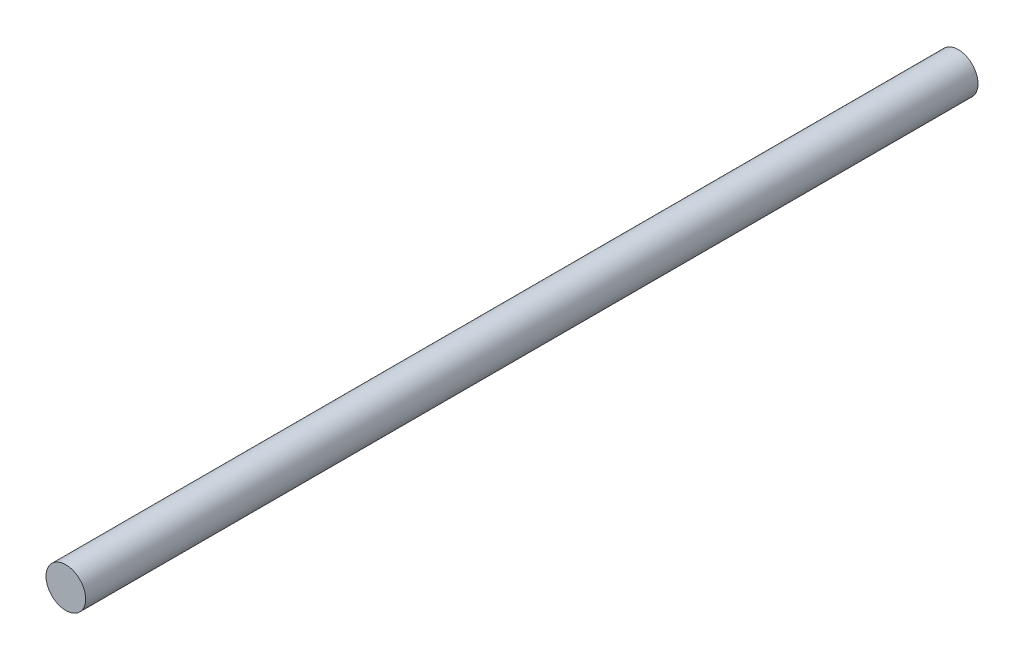
ISO-10303-21;
HEADER;
FILE_DESCRIPTION(('STEP AP214'),'2;1');
FILE_NAME('part.step','',(''),(''),'','','');
FILE_SCHEMA(('AUTOMOTIVE_DESIGN { 1 0 10303 214 1 1 1 1 }'));
ENDSEC;
DATA;
#1=APPLICATION_CONTEXT('core data for automotive mechanical design processes');
#2=APPLICATION_PROTOCOL_DEFINITION('international standard','automotive_design',2000,#1);
#3=PRODUCT_CONTEXT('',#1,'mechanical');
#4=PRODUCT('Part','Part','',(#3));
#5=PRODUCT_RELATED_PRODUCT_CATEGORY('part','',(#4));
#6=PRODUCT_DEFINITION_FORMATION('','',#4);
#7=PRODUCT_DEFINITION_CONTEXT('part definition',#1,'design');
#8=PRODUCT_DEFINITION('design','',#6,#7);
#9=PRODUCT_DEFINITION_SHAPE('','',#8);
#10=(LENGTH_UNIT() NAMED_UNIT(*) SI_UNIT(.MILLI.,.METRE.));
#11=(NAMED_UNIT(*) PLANE_ANGLE_UNIT() SI_UNIT($,.RADIAN.));
#12=(NAMED_UNIT(*) SI_UNIT($,.STERADIAN.) SOLID_ANGLE_UNIT());
#13=UNCERTAINTY_MEASURE_WITH_UNIT(LENGTH_MEASURE(1.E-05),#10,'distance_accuracy_value','');
#14=(GEOMETRIC_REPRESENTATION_CONTEXT(3) GLOBAL_UNCERTAINTY_ASSIGNED_CONTEXT((#13)) GLOBAL_UNIT_ASSIGNED_CONTEXT((#10,
#11,#12)) REPRESENTATION_CONTEXT('',''));
#15=CARTESIAN_POINT('',(0.,0.,0.));
#16=DIRECTION('',(0.,0.,1.));
#17=DIRECTION('',(1.,0.,0.));
#18=AXIS2_PLACEMENT_3D('',#15,#16,#17);
#19=CARTESIAN_POINT('',(-0.270441819863215,0.,90.));
#20=DIRECTION('',(0.,0.,-1.));
#21=DIRECTION('',(-1.,0.,0.));
#22=AXIS2_PLACEMENT_3D('',#19,#20,#21);
#23=CYLINDRICAL_SURFACE('',#22,2.);
#24=CARTESIAN_POINT('',(-0.270441819863215,0.,90.));
#25=DIRECTION('',(0.,0.,1.));
#26=DIRECTION('',(1.,0.,0.));
#27=AXIS2_PLACEMENT_3D('',#24,#25,#26);
#28=CIRCLE('',#27,2.);
#29=CARTESIAN_POINT('',(-2.27044181986322,0.,90.));
#30=VERTEX_POINT('',#29);
#31=EDGE_CURVE('E10',#30,#30,#28,.T.);
#32=CARTESIAN_POINT('',(-0.270441819863215,0.,0.));
#33=DIRECTION('',(0.,0.,1.));
#34=DIRECTION('',(1.,0.,0.));
#35=AXIS2_PLACEMENT_3D('',#32,#33,#34);
#36=CIRCLE('',#35,2.);
#37=CARTESIAN_POINT('',(-2.27044181986322,0.,0.));
#38=VERTEX_POINT('',#37);
#39=EDGE_CURVE('E39',#38,#38,#36,.T.);
#40=CARTESIAN_POINT('',(-2.27044181986322,0.,90.));
#41=CARTESIAN_POINT('',(-2.27044181986322,0.,89.0625));
#42=CARTESIAN_POINT('',(-2.27044181986322,0.,88.125));
#43=CARTESIAN_POINT('',(-2.27044181986322,0.,86.25));
#44=CARTESIAN_POINT('',(-2.27044181986322,0.,85.3125));
#45=CARTESIAN_POINT('',(-2.27044181986322,0.,83.4375));
#46=CARTESIAN_POINT('',(-2.27044181986322,0.,82.5));
#47=CARTESIAN_POINT('',(-2.27044181986322,0.,80.625));
#48=CARTESIAN_POINT('',(-2.27044181986322,0.,79.6875));
#49=CARTESIAN_POINT('',(-2.27044181986322,0.,77.8125));
#50=CARTESIAN_POINT('',(-2.27044181986322,0.,76.875));
#51=CARTESIAN_POINT('',(-2.27044181986322,0.,75.));
#52=CARTESIAN_POINT('',(-2.27044181986322,0.,74.0625));
#53=CARTESIAN_POINT('',(-2.27044181986322,0.,72.1875));
#54=CARTESIAN_POINT('',(-2.27044181986322,0.,71.25));
#55=CARTESIAN_POINT('',(-2.27044181986322,0.,69.375));
#56=CARTESIAN_POINT('',(-2.27044181986322,0.,68.4375));
#57=CARTESIAN_POINT('',(-2.27044181986322,0.,66.5625));
#58=CARTESIAN_POINT('',(-2.27044181986322,0.,65.625));
#59=CARTESIAN_POINT('',(-2.27044181986322,0.,63.75));
#60=CARTESIAN_POINT('',(-2.27044181986322,0.,62.8125));
#61=CARTESIAN_POINT('',(-2.27044181986322,0.,60.9375));
#62=CARTESIAN_POINT('',(-2.27044181986322,0.,60.));
#63=CARTESIAN_POINT('',(-2.27044181986322,0.,58.125));
#64=CARTESIAN_POINT('',(-2.27044181986322,0.,57.1875));
#65=CARTESIAN_POINT('',(-2.27044181986322,0.,55.3125));
#66=CARTESIAN_POINT('',(-2.27044181986322,0.,54.375));
#67=CARTESIAN_POINT('',(-2.27044181986322,0.,52.5));
#68=CARTESIAN_POINT('',(-2.27044181986322,0.,51.5625));
#69=CARTESIAN_POINT('',(-2.27044181986322,0.,49.6875));
#70=CARTESIAN_POINT('',(-2.27044181986322,0.,48.75));
#71=CARTESIAN_POINT('',(-2.27044181986322,0.,46.875));
#72=CARTESIAN_POINT('',(-2.27044181986322,0.,45.9375));
#73=CARTESIAN_POINT('',(-2.27044181986322,0.,44.0625));
#74=CARTESIAN_POINT('',(-2.27044181986322,0.,43.125));
#75=CARTESIAN_POINT('',(-2.27044181986322,0.,41.25));
#76=CARTESIAN_POINT('',(-2.27044181986322,0.,40.3125));
#77=CARTESIAN_POINT('',(-2.27044181986322,0.,38.4375));
#78=CARTESIAN_POINT('',(-2.27044181986322,0.,37.5));
#79=CARTESIAN_POINT('',(-2.27044181986322,0.,35.625));
#80=CARTESIAN_POINT('',(-2.27044181986322,0.,34.6875));
#81=CARTESIAN_POINT('',(-2.27044181986322,0.,32.8125));
#82=CARTESIAN_POINT('',(-2.27044181986322,0.,31.875));
#83=CARTESIAN_POINT('',(-2.27044181986322,0.,30.));
#84=CARTESIAN_POINT('',(-2.27044181986322,0.,29.0625));
#85=CARTESIAN_POINT('',(-2.27044181986322,0.,27.1875));
#86=CARTESIAN_POINT('',(-2.27044181986322,0.,26.25));
#87=CARTESIAN_POINT('',(-2.27044181986322,0.,24.375));
#88=CARTESIAN_POINT('',(-2.27044181986322,0.,23.4375));
#89=CARTESIAN_POINT('',(-2.27044181986322,0.,21.5625));
#90=CARTESIAN_POINT('',(-2.27044181986322,0.,20.625));
#91=CARTESIAN_POINT('',(-2.27044181986322,0.,18.75));
#92=CARTESIAN_POINT('',(-2.27044181986322,0.,17.8125));
#93=CARTESIAN_POINT('',(-2.27044181986322,0.,15.9375));
#94=CARTESIAN_POINT('',(-2.27044181986322,0.,15.));
#95=CARTESIAN_POINT('',(-2.27044181986322,0.,13.125));
#96=CARTESIAN_POINT('',(-2.27044181986322,0.,12.1875));
#97=CARTESIAN_POINT('',(-2.27044181986322,0.,10.3125));
#98=CARTESIAN_POINT('',(-2.27044181986322,0.,9.37499999999999));
#99=CARTESIAN_POINT('',(-2.27044181986322,0.,7.49999999999999));
#100=CARTESIAN_POINT('',(-2.27044181986322,0.,6.56249999999999));
#101=CARTESIAN_POINT('',(-2.27044181986322,0.,4.68749999999999));
#102=CARTESIAN_POINT('',(-2.27044181986322,0.,3.74999999999998));
#103=CARTESIAN_POINT('',(-2.27044181986322,0.,1.87499999999998));
#104=CARTESIAN_POINT('',(-2.27044181986322,0.,0.937499999999986));
#105=CARTESIAN_POINT('',(-2.27044181986322,0.,0.));
#106=B_SPLINE_CURVE_WITH_KNOTS('',3,(#40,#41,#42,#43,#44,#45,#46,#47,#48,#49,#50,#51,#52,#53,
#54,#55,#56,#57,#58,#59,#60,#61,#62,#63,#64,#65,#66,#67,#68,#69,#70,#71,#72,#73,#74,#75,#76,#77,
#78,#79,#80,#81,#82,#83,#84,#85,#86,#87,#88,#89,#90,#91,#92,#93,#94,#95,#96,#97,#98,#99,#100,
#101,#102,#103,#104,#105),.UNSPECIFIED.,.F.,.F.,(4,2,2,2,2,2,2,2,2,2,2,2,2,2,2,2,2,2,2,2,2,2,2,
2,2,2,2,2,2,2,2,2,4),(0.,2.8125,5.62499999999999,8.43749999999999,11.25,14.0625,16.875,19.6875,
22.5,25.3125,28.125,30.9375,33.75,36.5625,39.375,42.1875,45.,47.8125,50.625,53.4375,56.25,
59.0625,61.875,64.6875,67.5,70.3125,73.125,75.9375,78.75,81.5625,84.375,87.1875,90.),.UNSPECIFIED.);
#107=EDGE_CURVE('BSEAM36',#30,#38,#106,.T.);
#108=ORIENTED_EDGE('',*,*,#31,.F.);
#109=ORIENTED_EDGE('',*,*,#39,.T.);
#110=ORIENTED_EDGE('',*,*,#107,.T.);
#111=ORIENTED_EDGE('',*,*,#107,.F.);
#112=EDGE_LOOP('',(#108,#110,#109,#111));
#113=FACE_BOUND('',#112,.T.);
#114=ADVANCED_FACE('F36',(#113),#23,.T.);
#115=CARTESIAN_POINT('',(-0.270441819863215,0.,90.));
#116=DIRECTION('',(0.,0.,1.));
#117=DIRECTION('',(1.,0.,0.));
#118=AXIS2_PLACEMENT_3D('',#115,#116,#117);
#119=PLANE('',#118);
#120=ORIENTED_EDGE('',*,*,#31,.T.);
#121=EDGE_LOOP('',(#120));
#122=FACE_BOUND('',#121,.T.);
#123=ADVANCED_FACE('F51',(#122),#119,.T.);
#124=CARTESIAN_POINT('',(-0.270441819863215,0.,0.));
#125=DIRECTION('',(0.,0.,1.));
#126=DIRECTION('',(1.,0.,0.));
#127=AXIS2_PLACEMENT_3D('',#124,#125,#126);
#128=PLANE('',#127);
#129=ORIENTED_EDGE('',*,*,#39,.F.);
#130=EDGE_LOOP('',(#129));
#131=FACE_BOUND('',#130,.T.);
#132=ADVANCED_FACE('F49',(#131),#128,.F.);
#133=CLOSED_SHELL('',(#114,#123,#132));
#134=MANIFOLD_SOLID_BREP('B2',#133);
#135=ADVANCED_BREP_SHAPE_REPRESENTATION('',(#18,#134),#14);
#136=SHAPE_DEFINITION_REPRESENTATION(#9,#135);
ENDSEC;
END-ISO-10303-21;
